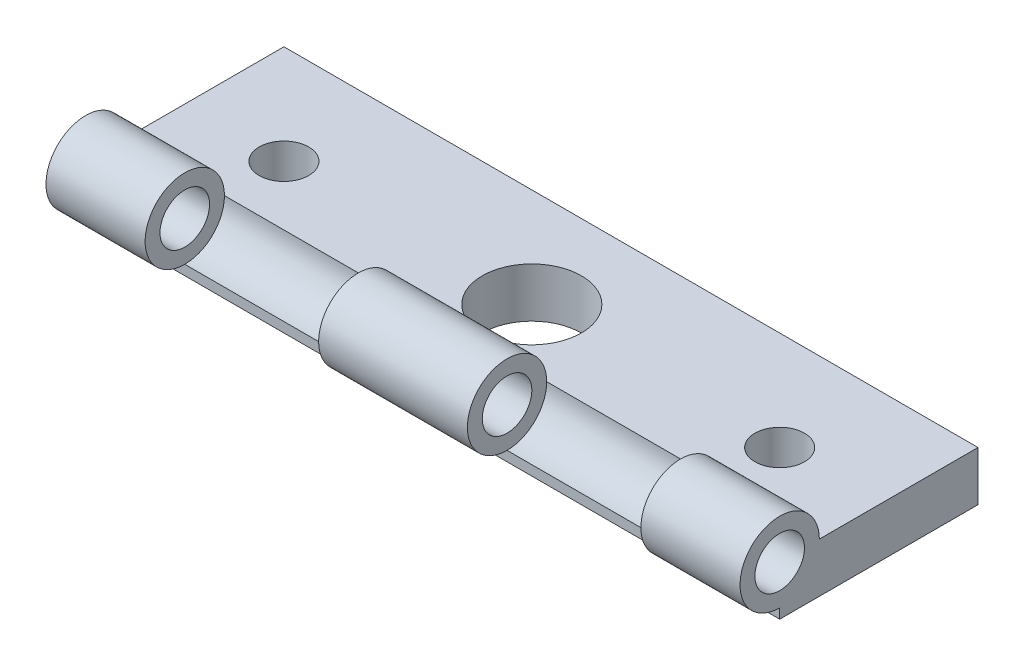
ISO-10303-21;
HEADER;
FILE_DESCRIPTION(('STEP AP214'),'2;1');
FILE_NAME('part.step','',(''),(''),'','','');
FILE_SCHEMA(('AUTOMOTIVE_DESIGN { 1 0 10303 214 1 1 1 1 }'));
ENDSEC;
DATA;
#1=APPLICATION_CONTEXT('core data for automotive mechanical design processes');
#2=APPLICATION_PROTOCOL_DEFINITION('international standard','automotive_design',2000,#1);
#3=PRODUCT_CONTEXT('',#1,'mechanical');
#4=PRODUCT('Part','Part','',(#3));
#5=PRODUCT_RELATED_PRODUCT_CATEGORY('part','',(#4));
#6=PRODUCT_DEFINITION_FORMATION('','',#4);
#7=PRODUCT_DEFINITION_CONTEXT('part definition',#1,'design');
#8=PRODUCT_DEFINITION('design','',#6,#7);
#9=PRODUCT_DEFINITION_SHAPE('','',#8);
#10=(LENGTH_UNIT() NAMED_UNIT(*) SI_UNIT(.MILLI.,.METRE.));
#11=(NAMED_UNIT(*) PLANE_ANGLE_UNIT() SI_UNIT($,.RADIAN.));
#12=(NAMED_UNIT(*) SI_UNIT($,.STERADIAN.) SOLID_ANGLE_UNIT());
#13=UNCERTAINTY_MEASURE_WITH_UNIT(LENGTH_MEASURE(1.E-05),#10,'distance_accuracy_value','');
#14=(GEOMETRIC_REPRESENTATION_CONTEXT(3) GLOBAL_UNCERTAINTY_ASSIGNED_CONTEXT((#13)) GLOBAL_UNIT_ASSIGNED_CONTEXT((#10,
#11,#12)) REPRESENTATION_CONTEXT('',''));
#15=CARTESIAN_POINT('',(0.,0.,0.));
#16=DIRECTION('',(0.,0.,1.));
#17=DIRECTION('',(1.,0.,0.));
#18=AXIS2_PLACEMENT_3D('',#15,#16,#17);
#19=CARTESIAN_POINT('',(44.45,6.35,0.));
#20=DIRECTION('',(-1.,0.,0.));
#21=DIRECTION('',(0.,0.,1.));
#22=AXIS2_PLACEMENT_3D('',#19,#20,#21);
#23=CYLINDRICAL_SURFACE('',#22,5.08);
#24=CARTESIAN_POINT('',(-9.525,6.35,0.));
#25=DIRECTION('',(1.,0.,0.));
#26=DIRECTION('',(0.,0.,-1.));
#27=AXIS2_PLACEMENT_3D('',#24,#25,#26);
#28=CIRCLE('',#27,5.08);
#29=CARTESIAN_POINT('',(-9.525,1.27,0.));
#30=VERTEX_POINT('',#29);
#31=CARTESIAN_POINT('',(-9.525,6.35,-5.08));
#32=VERTEX_POINT('',#31);
#33=EDGE_CURVE('E371',#30,#32,#28,.T.);
#34=ORIENTED_EDGE('',*,*,#33,.T.);
#35=DIRECTION('',(-1.,0.,0.));
#36=VECTOR('',#35,1.);
#37=CARTESIAN_POINT('',(44.45,6.35,-5.08));
#38=LINE('',#37,#36);
#39=CARTESIAN_POINT('',(-31.75,6.35,-5.08));
#40=VERTEX_POINT('',#39);
#41=EDGE_CURVE('E133',#40,#32,#38,.F.);
#42=ORIENTED_EDGE('',*,*,#41,.F.);
#43=CARTESIAN_POINT('',(-31.75,6.35,0.));
#44=DIRECTION('',(-1.,0.,0.));
#45=DIRECTION('',(0.,0.,1.));
#46=AXIS2_PLACEMENT_3D('',#43,#44,#45);
#47=CIRCLE('',#46,5.08);
#48=CARTESIAN_POINT('',(-31.75,1.27,0.));
#49=VERTEX_POINT('',#48);
#50=EDGE_CURVE('E134',#40,#49,#47,.T.);
#51=ORIENTED_EDGE('',*,*,#50,.T.);
#52=DIRECTION('',(-1.,0.,0.));
#53=VECTOR('',#52,1.);
#54=CARTESIAN_POINT('',(44.45,1.27,0.));
#55=LINE('',#54,#53);
#56=EDGE_CURVE('E48',#30,#49,#55,.T.);
#57=ORIENTED_EDGE('',*,*,#56,.F.);
#58=EDGE_LOOP('',(#34,#42,#51,#57));
#59=FACE_BOUND('',#58,.T.);
#60=ADVANCED_FACE('F39',(#59),#23,.F.);
#61=CARTESIAN_POINT('',(9.525,6.35,-5.08));
#62=VERTEX_POINT('',#61);
#63=CARTESIAN_POINT('',(31.75,6.35,-5.08));
#64=VERTEX_POINT('',#63);
#65=EDGE_CURVE('E128',#62,#64,#38,.F.);
#66=ORIENTED_EDGE('',*,*,#65,.F.);
#67=CARTESIAN_POINT('',(9.525,6.35,0.));
#68=DIRECTION('',(1.,0.,0.));
#69=DIRECTION('',(0.,0.,-1.));
#70=AXIS2_PLACEMENT_3D('',#67,#68,#69);
#71=CIRCLE('',#70,5.08);
#72=CARTESIAN_POINT('',(9.525,1.27,0.));
#73=VERTEX_POINT('',#72);
#74=EDGE_CURVE('E113',#73,#62,#71,.T.);
#75=ORIENTED_EDGE('',*,*,#74,.F.);
#76=CARTESIAN_POINT('',(31.75,1.27,0.));
#77=VERTEX_POINT('',#76);
#78=EDGE_CURVE('E47',#77,#73,#55,.T.);
#79=ORIENTED_EDGE('',*,*,#78,.F.);
#80=CARTESIAN_POINT('',(31.75,6.35,0.));
#81=DIRECTION('',(-1.,0.,0.));
#82=DIRECTION('',(0.,0.,1.));
#83=AXIS2_PLACEMENT_3D('',#80,#81,#82);
#84=CIRCLE('',#83,5.08);
#85=EDGE_CURVE('E63',#64,#77,#84,.T.);
#86=ORIENTED_EDGE('',*,*,#85,.F.);
#87=EDGE_LOOP('',(#66,#75,#79,#86));
#88=FACE_BOUND('',#87,.T.);
#89=ADVANCED_FACE('F129',(#88),#23,.F.);
#90=CARTESIAN_POINT('',(0.,6.35,0.));
#91=DIRECTION('',(0.,-1.,0.));
#92=DIRECTION('',(0.,0.,-1.));
#93=AXIS2_PLACEMENT_3D('',#90,#91,#92);
#94=PLANE('',#93);
#95=DIRECTION('',(0.,0.,1.));
#96=VECTOR('',#95,1.);
#97=CARTESIAN_POINT('',(-44.45,6.35,0.));
#98=LINE('',#97,#96);
#99=CARTESIAN_POINT('',(-44.45,6.35,-25.4));
#100=VERTEX_POINT('',#99);
#101=CARTESIAN_POINT('',(-44.45,6.35,-5.08));
#102=VERTEX_POINT('',#101);
#103=EDGE_CURVE('E192',#100,#102,#98,.T.);
#104=ORIENTED_EDGE('',*,*,#103,.T.);
#105=EDGE_CURVE('E136',#102,#40,#38,.F.);
#106=ORIENTED_EDGE('',*,*,#105,.T.);
#107=ORIENTED_EDGE('',*,*,#41,.T.);
#108=DIRECTION('',(-1.,0.,0.));
#109=VECTOR('',#108,1.);
#110=CARTESIAN_POINT('',(9.525,6.35,-5.08));
#111=LINE('',#110,#109);
#112=EDGE_CURVE('E125',#62,#32,#111,.T.);
#113=ORIENTED_EDGE('',*,*,#112,.F.);
#114=ORIENTED_EDGE('',*,*,#65,.T.);
#115=DIRECTION('',(1.,0.,0.));
#116=VECTOR('',#115,1.);
#117=CARTESIAN_POINT('',(31.75,6.35,-5.08));
#118=LINE('',#117,#116);
#119=CARTESIAN_POINT('',(44.45,6.35,-5.08));
#120=VERTEX_POINT('',#119);
#121=EDGE_CURVE('E152',#120,#64,#118,.F.);
#122=ORIENTED_EDGE('',*,*,#121,.F.);
#123=DIRECTION('',(0.,0.,-1.));
#124=VECTOR('',#123,1.);
#125=CARTESIAN_POINT('',(44.45,6.35,0.));
#126=LINE('',#125,#124);
#127=CARTESIAN_POINT('',(44.45,6.35,-25.4));
#128=VERTEX_POINT('',#127);
#129=EDGE_CURVE('E187',#120,#128,#126,.T.);
#130=ORIENTED_EDGE('',*,*,#129,.T.);
#131=DIRECTION('',(-1.,0.,0.));
#132=VECTOR('',#131,1.);
#133=CARTESIAN_POINT('',(-44.45,6.35,-25.4));
#134=LINE('',#133,#132);
#135=EDGE_CURVE('E189',#128,#100,#134,.T.);
#136=ORIENTED_EDGE('',*,*,#135,.T.);
#137=EDGE_LOOP('',(#104,#106,#107,#113,#114,#122,#130,#136));
#138=FACE_BOUND('',#137,.T.);
#139=CARTESIAN_POINT('',(-31.75,6.35,-12.7));
#140=DIRECTION('',(0.,1.,0.));
#141=DIRECTION('',(0.,0.,1.));
#142=AXIS2_PLACEMENT_3D('',#139,#140,#141);
#143=CIRCLE('',#142,3.175);
#144=CARTESIAN_POINT('',(-31.75,6.35,-9.52500000000001));
#145=VERTEX_POINT('',#144);
#146=EDGE_CURVE('E181',#145,#145,#143,.T.);
#147=ORIENTED_EDGE('',*,*,#146,.F.);
#148=EDGE_LOOP('',(#147));
#149=FACE_BOUND('',#148,.T.);
#150=CARTESIAN_POINT('',(0.,6.35,-12.7));
#151=DIRECTION('',(0.,1.,0.));
#152=DIRECTION('',(0.,0.,1.));
#153=AXIS2_PLACEMENT_3D('',#150,#151,#152);
#154=CIRCLE('',#153,6.35);
#155=CARTESIAN_POINT('',(0.,6.35,-6.35));
#156=VERTEX_POINT('',#155);
#157=EDGE_CURVE('E175',#156,#156,#154,.T.);
#158=ORIENTED_EDGE('',*,*,#157,.F.);
#159=EDGE_LOOP('',(#158));
#160=FACE_BOUND('',#159,.T.);
#161=CARTESIAN_POINT('',(31.75,6.35,-12.7));
#162=DIRECTION('',(0.,1.,0.));
#163=DIRECTION('',(0.,0.,1.));
#164=AXIS2_PLACEMENT_3D('',#161,#162,#163);
#165=CIRCLE('',#164,3.175);
#166=CARTESIAN_POINT('',(31.75,6.35,-9.52500000000001));
#167=VERTEX_POINT('',#166);
#168=EDGE_CURVE('E169',#167,#167,#165,.T.);
#169=ORIENTED_EDGE('',*,*,#168,.F.);
#170=EDGE_LOOP('',(#169));
#171=FACE_BOUND('',#170,.T.);
#172=ADVANCED_FACE('F138',(#138,#149,#160,#171),#94,.F.);
#173=CARTESIAN_POINT('',(0.,0.,0.));
#174=DIRECTION('',(0.,-1.,0.));
#175=DIRECTION('',(0.,0.,-1.));
#176=AXIS2_PLACEMENT_3D('',#173,#174,#175);
#177=PLANE('',#176);
#178=CARTESIAN_POINT('',(0.,0.,-12.7));
#179=DIRECTION('',(0.,1.,0.));
#180=DIRECTION('',(0.,0.,1.));
#181=AXIS2_PLACEMENT_3D('',#178,#179,#180);
#182=CIRCLE('',#181,6.35);
#183=CARTESIAN_POINT('',(0.,0.,-6.35));
#184=VERTEX_POINT('',#183);
#185=EDGE_CURVE('E172',#184,#184,#182,.T.);
#186=ORIENTED_EDGE('',*,*,#185,.T.);
#187=EDGE_LOOP('',(#186));
#188=FACE_BOUND('',#187,.T.);
#189=DIRECTION('',(0.,0.,-1.));
#190=VECTOR('',#189,1.);
#191=CARTESIAN_POINT('',(44.45,0.,0.));
#192=LINE('',#191,#190);
#193=CARTESIAN_POINT('',(44.45,0.,0.));
#194=VERTEX_POINT('',#193);
#195=CARTESIAN_POINT('',(44.45,0.,-25.4));
#196=VERTEX_POINT('',#195);
#197=EDGE_CURVE('E184',#194,#196,#192,.T.);
#198=ORIENTED_EDGE('',*,*,#197,.F.);
#199=DIRECTION('',(1.,0.,0.));
#200=VECTOR('',#199,1.);
#201=CARTESIAN_POINT('',(-44.45,0.,0.));
#202=LINE('',#201,#200);
#203=CARTESIAN_POINT('',(-44.45,0.,0.));
#204=VERTEX_POINT('',#203);
#205=EDGE_CURVE('E190',#204,#194,#202,.T.);
#206=ORIENTED_EDGE('',*,*,#205,.F.);
#207=DIRECTION('',(0.,0.,1.));
#208=VECTOR('',#207,1.);
#209=CARTESIAN_POINT('',(-44.45,0.,0.));
#210=LINE('',#209,#208);
#211=CARTESIAN_POINT('',(-44.45,0.,-25.4));
#212=VERTEX_POINT('',#211);
#213=EDGE_CURVE('E199',#212,#204,#210,.T.);
#214=ORIENTED_EDGE('',*,*,#213,.F.);
#215=DIRECTION('',(-1.,0.,0.));
#216=VECTOR('',#215,1.);
#217=CARTESIAN_POINT('',(-44.45,0.,-25.4));
#218=LINE('',#217,#216);
#219=EDGE_CURVE('E197',#196,#212,#218,.T.);
#220=ORIENTED_EDGE('',*,*,#219,.F.);
#221=EDGE_LOOP('',(#198,#206,#214,#220));
#222=FACE_BOUND('',#221,.T.);
#223=CARTESIAN_POINT('',(-31.75,0.,-12.7));
#224=DIRECTION('',(0.,1.,0.));
#225=DIRECTION('',(0.,0.,1.));
#226=AXIS2_PLACEMENT_3D('',#223,#224,#225);
#227=CIRCLE('',#226,3.175);
#228=CARTESIAN_POINT('',(-31.75,0.,-9.52500000000001));
#229=VERTEX_POINT('',#228);
#230=EDGE_CURVE('E178',#229,#229,#227,.T.);
#231=ORIENTED_EDGE('',*,*,#230,.T.);
#232=EDGE_LOOP('',(#231));
#233=FACE_BOUND('',#232,.T.);
#234=CARTESIAN_POINT('',(31.75,0.,-12.7));
#235=DIRECTION('',(0.,1.,0.));
#236=DIRECTION('',(0.,0.,1.));
#237=AXIS2_PLACEMENT_3D('',#234,#235,#236);
#238=CIRCLE('',#237,3.175);
#239=CARTESIAN_POINT('',(31.75,0.,-9.52500000000001));
#240=VERTEX_POINT('',#239);
#241=EDGE_CURVE('E168',#240,#240,#238,.T.);
#242=ORIENTED_EDGE('',*,*,#241,.T.);
#243=EDGE_LOOP('',(#242));
#244=FACE_BOUND('',#243,.T.);
#245=ADVANCED_FACE('F264',(#188,#222,#233,#244),#177,.T.);
#246=CARTESIAN_POINT('',(44.45,6.35,0.));
#247=DIRECTION('',(-1.,0.,0.));
#248=DIRECTION('',(0.,0.,1.));
#249=AXIS2_PLACEMENT_3D('',#246,#247,#248);
#250=PLANE('',#249);
#251=ORIENTED_EDGE('',*,*,#129,.F.);
#252=CARTESIAN_POINT('',(44.45,6.35,0.));
#253=DIRECTION('',(-1.,0.,0.));
#254=DIRECTION('',(0.,0.,1.));
#255=AXIS2_PLACEMENT_3D('',#252,#253,#254);
#256=CIRCLE('',#255,5.08);
#257=CARTESIAN_POINT('',(44.45,1.27,0.));
#258=VERTEX_POINT('',#257);
#259=EDGE_CURVE('E149',#258,#120,#256,.T.);
#260=ORIENTED_EDGE('',*,*,#259,.F.);
#261=DIRECTION('',(0.,-1.,0.));
#262=VECTOR('',#261,1.);
#263=CARTESIAN_POINT('',(44.45,6.35,0.));
#264=LINE('',#263,#262);
#265=EDGE_CURVE('E194',#258,#194,#264,.T.);
#266=ORIENTED_EDGE('',*,*,#265,.T.);
#267=ORIENTED_EDGE('',*,*,#197,.T.);
#268=DIRECTION('',(0.,-1.,0.));
#269=VECTOR('',#268,1.);
#270=CARTESIAN_POINT('',(44.45,6.35,-25.4));
#271=LINE('',#270,#269);
#272=EDGE_CURVE('E209',#128,#196,#271,.T.);
#273=ORIENTED_EDGE('',*,*,#272,.F.);
#274=EDGE_LOOP('',(#251,#260,#266,#267,#273));
#275=FACE_BOUND('',#274,.T.);
#276=CARTESIAN_POINT('',(44.45,6.35,0.));
#277=DIRECTION('',(-1.,0.,0.));
#278=DIRECTION('',(0.,0.,1.));
#279=AXIS2_PLACEMENT_3D('',#276,#277,#278);
#280=CIRCLE('',#279,3.175);
#281=CARTESIAN_POINT('',(44.45,6.35,3.175));
#282=VERTEX_POINT('',#281);
#283=EDGE_CURVE('E141',#282,#282,#280,.T.);
#284=ORIENTED_EDGE('',*,*,#283,.T.);
#285=EDGE_LOOP('',(#284));
#286=FACE_BOUND('',#285,.T.);
#287=ADVANCED_FACE('F41',(#275,#286),#250,.F.);
#288=CARTESIAN_POINT('',(-44.45,6.35,-25.4));
#289=DIRECTION('',(0.,0.,1.));
#290=DIRECTION('',(1.,0.,0.));
#291=AXIS2_PLACEMENT_3D('',#288,#289,#290);
#292=PLANE('',#291);
#293=ORIENTED_EDGE('',*,*,#219,.T.);
#294=DIRECTION('',(0.,-1.,0.));
#295=VECTOR('',#294,1.);
#296=CARTESIAN_POINT('',(-44.45,6.35,-25.4));
#297=LINE('',#296,#295);
#298=EDGE_CURVE('E207',#100,#212,#297,.T.);
#299=ORIENTED_EDGE('',*,*,#298,.F.);
#300=ORIENTED_EDGE('',*,*,#135,.F.);
#301=ORIENTED_EDGE('',*,*,#272,.T.);
#302=EDGE_LOOP('',(#293,#299,#300,#301));
#303=FACE_BOUND('',#302,.T.);
#304=ADVANCED_FACE('F272',(#303),#292,.F.);
#305=CARTESIAN_POINT('',(-44.45,6.35,0.));
#306=DIRECTION('',(1.,0.,0.));
#307=DIRECTION('',(0.,0.,-1.));
#308=AXIS2_PLACEMENT_3D('',#305,#306,#307);
#309=PLANE('',#308);
#310=DIRECTION('',(0.,-1.,0.));
#311=VECTOR('',#310,1.);
#312=CARTESIAN_POINT('',(-44.45,6.35,0.));
#313=LINE('',#312,#311);
#314=CARTESIAN_POINT('',(-44.45,1.27,0.));
#315=VERTEX_POINT('',#314);
#316=EDGE_CURVE('E205',#315,#204,#313,.T.);
#317=ORIENTED_EDGE('',*,*,#316,.F.);
#318=CARTESIAN_POINT('',(-44.45,6.35,0.));
#319=DIRECTION('',(-1.,0.,0.));
#320=DIRECTION('',(0.,0.,1.));
#321=AXIS2_PLACEMENT_3D('',#318,#319,#320);
#322=CIRCLE('',#321,5.08);
#323=EDGE_CURVE('E160',#315,#102,#322,.T.);
#324=ORIENTED_EDGE('',*,*,#323,.T.);
#325=ORIENTED_EDGE('',*,*,#103,.F.);
#326=ORIENTED_EDGE('',*,*,#298,.T.);
#327=ORIENTED_EDGE('',*,*,#213,.T.);
#328=EDGE_LOOP('',(#317,#324,#325,#326,#327));
#329=FACE_BOUND('',#328,.T.);
#330=CARTESIAN_POINT('',(-44.45,6.35,0.));
#331=DIRECTION('',(-1.,0.,0.));
#332=DIRECTION('',(0.,0.,1.));
#333=AXIS2_PLACEMENT_3D('',#330,#331,#332);
#334=CIRCLE('',#333,3.175);
#335=CARTESIAN_POINT('',(-44.45,6.35,3.175));
#336=VERTEX_POINT('',#335);
#337=EDGE_CURVE('E156',#336,#336,#334,.T.);
#338=ORIENTED_EDGE('',*,*,#337,.F.);
#339=EDGE_LOOP('',(#338));
#340=FACE_BOUND('',#339,.T.);
#341=ADVANCED_FACE('F270',(#329,#340),#309,.F.);
#342=CARTESIAN_POINT('',(-44.45,6.35,0.));
#343=DIRECTION('',(0.,0.,-1.));
#344=DIRECTION('',(-1.,0.,0.));
#345=AXIS2_PLACEMENT_3D('',#342,#343,#344);
#346=PLANE('',#345);
#347=ORIENTED_EDGE('',*,*,#265,.F.);
#348=EDGE_CURVE('E11',#258,#77,#55,.T.);
#349=ORIENTED_EDGE('',*,*,#348,.T.);
#350=ORIENTED_EDGE('',*,*,#78,.T.);
#351=EDGE_CURVE('E127',#73,#30,#55,.T.);
#352=ORIENTED_EDGE('',*,*,#351,.T.);
#353=ORIENTED_EDGE('',*,*,#56,.T.);
#354=EDGE_CURVE('E49',#49,#315,#55,.T.);
#355=ORIENTED_EDGE('',*,*,#354,.T.);
#356=ORIENTED_EDGE('',*,*,#316,.T.);
#357=ORIENTED_EDGE('',*,*,#205,.T.);
#358=EDGE_LOOP('',(#347,#349,#350,#352,#353,#355,#356,#357));
#359=FACE_BOUND('',#358,.T.);
#360=ADVANCED_FACE('F219',(#359),#346,.F.);
#361=CARTESIAN_POINT('',(-31.75,6.35,-12.7));
#362=DIRECTION('',(0.,-1.,0.));
#363=DIRECTION('',(0.,0.,-1.));
#364=AXIS2_PLACEMENT_3D('',#361,#362,#363);
#365=CYLINDRICAL_SURFACE('',#364,3.175);
#366=ORIENTED_EDGE('',*,*,#146,.T.);
#367=EDGE_LOOP('',(#366));
#368=FACE_BOUND('',#367,.T.);
#369=ORIENTED_EDGE('',*,*,#230,.F.);
#370=EDGE_LOOP('',(#369));
#371=FACE_BOUND('',#370,.T.);
#372=ADVANCED_FACE('F257',(#368,#371),#365,.F.);
#373=CARTESIAN_POINT('',(0.,6.35,-12.7));
#374=DIRECTION('',(0.,-1.,0.));
#375=DIRECTION('',(0.,0.,-1.));
#376=AXIS2_PLACEMENT_3D('',#373,#374,#375);
#377=CYLINDRICAL_SURFACE('',#376,6.35);
#378=ORIENTED_EDGE('',*,*,#157,.T.);
#379=EDGE_LOOP('',(#378));
#380=FACE_BOUND('',#379,.T.);
#381=ORIENTED_EDGE('',*,*,#185,.F.);
#382=EDGE_LOOP('',(#381));
#383=FACE_BOUND('',#382,.T.);
#384=ADVANCED_FACE('F253',(#380,#383),#377,.F.);
#385=CARTESIAN_POINT('',(31.75,6.35,-12.7));
#386=DIRECTION('',(0.,-1.,0.));
#387=DIRECTION('',(0.,0.,-1.));
#388=AXIS2_PLACEMENT_3D('',#385,#386,#387);
#389=CYLINDRICAL_SURFACE('',#388,3.175);
#390=ORIENTED_EDGE('',*,*,#168,.T.);
#391=EDGE_LOOP('',(#390));
#392=FACE_BOUND('',#391,.T.);
#393=ORIENTED_EDGE('',*,*,#241,.F.);
#394=EDGE_LOOP('',(#393));
#395=FACE_BOUND('',#394,.T.);
#396=ADVANCED_FACE('F242',(#392,#395),#389,.F.);
#397=CARTESIAN_POINT('',(-31.75,6.35,0.));
#398=DIRECTION('',(-1.,0.,0.));
#399=DIRECTION('',(0.,0.,1.));
#400=AXIS2_PLACEMENT_3D('',#397,#398,#399);
#401=CYLINDRICAL_SURFACE('',#400,5.08);
#402=ORIENTED_EDGE('',*,*,#105,.F.);
#403=ORIENTED_EDGE('',*,*,#323,.F.);
#404=ORIENTED_EDGE('',*,*,#354,.F.);
#405=EDGE_CURVE('E165',#49,#40,#47,.T.);
#406=ORIENTED_EDGE('',*,*,#405,.T.);
#407=EDGE_LOOP('',(#402,#403,#404,#406));
#408=FACE_BOUND('',#407,.T.);
#409=ADVANCED_FACE('F229',(#408),#401,.T.);
#410=CARTESIAN_POINT('',(-31.75,6.35,0.));
#411=DIRECTION('',(-1.,0.,0.));
#412=DIRECTION('',(0.,0.,1.));
#413=AXIS2_PLACEMENT_3D('',#410,#411,#412);
#414=PLANE('',#413);
#415=CARTESIAN_POINT('',(-31.75,6.35,0.));
#416=DIRECTION('',(-1.,0.,0.));
#417=DIRECTION('',(0.,0.,1.));
#418=AXIS2_PLACEMENT_3D('',#415,#416,#417);
#419=CIRCLE('',#418,3.175);
#420=CARTESIAN_POINT('',(-31.75,6.35,3.175));
#421=VERTEX_POINT('',#420);
#422=EDGE_CURVE('E157',#421,#421,#419,.T.);
#423=ORIENTED_EDGE('',*,*,#422,.T.);
#424=EDGE_LOOP('',(#423));
#425=FACE_BOUND('',#424,.T.);
#426=ORIENTED_EDGE('',*,*,#50,.F.);
#427=ORIENTED_EDGE('',*,*,#405,.F.);
#428=EDGE_LOOP('',(#426,#427));
#429=FACE_BOUND('',#428,.T.);
#430=ADVANCED_FACE('F230',(#425,#429),#414,.F.);
#431=CARTESIAN_POINT('',(-31.75,6.35,0.));
#432=DIRECTION('',(-1.,0.,0.));
#433=DIRECTION('',(0.,0.,1.));
#434=AXIS2_PLACEMENT_3D('',#431,#432,#433);
#435=CYLINDRICAL_SURFACE('',#434,3.175);
#436=ORIENTED_EDGE('',*,*,#422,.F.);
#437=EDGE_LOOP('',(#436));
#438=FACE_BOUND('',#437,.T.);
#439=ORIENTED_EDGE('',*,*,#337,.T.);
#440=EDGE_LOOP('',(#439));
#441=FACE_BOUND('',#440,.T.);
#442=ADVANCED_FACE('F232',(#438,#441),#435,.F.);
#443=CARTESIAN_POINT('',(31.75,6.35,0.));
#444=DIRECTION('',(1.,0.,0.));
#445=DIRECTION('',(0.,0.,-1.));
#446=AXIS2_PLACEMENT_3D('',#443,#444,#445);
#447=CYLINDRICAL_SURFACE('',#446,5.08);
#448=ORIENTED_EDGE('',*,*,#259,.T.);
#449=ORIENTED_EDGE('',*,*,#121,.T.);
#450=EDGE_CURVE('E153',#77,#64,#84,.T.);
#451=ORIENTED_EDGE('',*,*,#450,.F.);
#452=ORIENTED_EDGE('',*,*,#348,.F.);
#453=EDGE_LOOP('',(#448,#449,#451,#452));
#454=FACE_BOUND('',#453,.T.);
#455=ADVANCED_FACE('F239',(#454),#447,.T.);
#456=CARTESIAN_POINT('',(31.75,6.35,0.));
#457=DIRECTION('',(1.,0.,0.));
#458=DIRECTION('',(0.,0.,1.));
#459=AXIS2_PLACEMENT_3D('',#456,#457,#458);
#460=PLANE('',#459);
#461=ORIENTED_EDGE('',*,*,#85,.T.);
#462=ORIENTED_EDGE('',*,*,#450,.T.);
#463=EDGE_LOOP('',(#461,#462));
#464=FACE_BOUND('',#463,.T.);
#465=CARTESIAN_POINT('',(31.75,6.35,0.));
#466=DIRECTION('',(-1.,0.,0.));
#467=DIRECTION('',(0.,0.,1.));
#468=AXIS2_PLACEMENT_3D('',#465,#466,#467);
#469=CIRCLE('',#468,3.175);
#470=CARTESIAN_POINT('',(31.75,6.35,3.175));
#471=VERTEX_POINT('',#470);
#472=EDGE_CURVE('E144',#471,#471,#469,.T.);
#473=ORIENTED_EDGE('',*,*,#472,.F.);
#474=EDGE_LOOP('',(#473));
#475=FACE_BOUND('',#474,.T.);
#476=ADVANCED_FACE('F291',(#464,#475),#460,.F.);
#477=CARTESIAN_POINT('',(31.75,6.35,0.));
#478=DIRECTION('',(1.,0.,0.));
#479=DIRECTION('',(0.,0.,-1.));
#480=AXIS2_PLACEMENT_3D('',#477,#478,#479);
#481=CYLINDRICAL_SURFACE('',#480,3.175);
#482=ORIENTED_EDGE('',*,*,#472,.T.);
#483=EDGE_LOOP('',(#482));
#484=FACE_BOUND('',#483,.T.);
#485=ORIENTED_EDGE('',*,*,#283,.F.);
#486=EDGE_LOOP('',(#485));
#487=FACE_BOUND('',#486,.T.);
#488=ADVANCED_FACE('F294',(#484,#487),#481,.F.);
#489=CARTESIAN_POINT('',(9.525,6.35,0.));
#490=DIRECTION('',(-1.,0.,0.));
#491=DIRECTION('',(0.,0.,1.));
#492=AXIS2_PLACEMENT_3D('',#489,#490,#491);
#493=CYLINDRICAL_SURFACE('',#492,5.08);
#494=EDGE_CURVE('E117',#62,#73,#71,.T.);
#495=ORIENTED_EDGE('',*,*,#494,.F.);
#496=ORIENTED_EDGE('',*,*,#112,.T.);
#497=EDGE_CURVE('E56',#32,#30,#28,.T.);
#498=ORIENTED_EDGE('',*,*,#497,.T.);
#499=ORIENTED_EDGE('',*,*,#351,.F.);
#500=EDGE_LOOP('',(#495,#496,#498,#499));
#501=FACE_BOUND('',#500,.T.);
#502=ADVANCED_FACE('F123',(#501),#493,.T.);
#503=CARTESIAN_POINT('',(9.525,6.35,0.));
#504=DIRECTION('',(1.,0.,0.));
#505=DIRECTION('',(0.,0.,-1.));
#506=AXIS2_PLACEMENT_3D('',#503,#504,#505);
#507=PLANE('',#506);
#508=ORIENTED_EDGE('',*,*,#494,.T.);
#509=ORIENTED_EDGE('',*,*,#74,.T.);
#510=EDGE_LOOP('',(#508,#509));
#511=FACE_BOUND('',#510,.T.);
#512=CARTESIAN_POINT('',(9.525,6.35,0.));
#513=DIRECTION('',(1.,0.,0.));
#514=DIRECTION('',(0.,0.,-1.));
#515=AXIS2_PLACEMENT_3D('',#512,#513,#514);
#516=CIRCLE('',#515,3.175);
#517=CARTESIAN_POINT('',(9.525,6.35,3.175));
#518=VERTEX_POINT('',#517);
#519=EDGE_CURVE('E365',#518,#518,#516,.T.);
#520=ORIENTED_EDGE('',*,*,#519,.F.);
#521=EDGE_LOOP('',(#520));
#522=FACE_BOUND('',#521,.T.);
#523=ADVANCED_FACE('F115',(#511,#522),#507,.T.);
#524=CARTESIAN_POINT('',(-9.525,6.35,0.));
#525=DIRECTION('',(1.,0.,0.));
#526=DIRECTION('',(0.,0.,-1.));
#527=AXIS2_PLACEMENT_3D('',#524,#525,#526);
#528=PLANE('',#527);
#529=ORIENTED_EDGE('',*,*,#497,.F.);
#530=ORIENTED_EDGE('',*,*,#33,.F.);
#531=EDGE_LOOP('',(#529,#530));
#532=FACE_BOUND('',#531,.T.);
#533=CARTESIAN_POINT('',(-9.525,6.35,0.));
#534=DIRECTION('',(1.,0.,0.));
#535=DIRECTION('',(0.,0.,-1.));
#536=AXIS2_PLACEMENT_3D('',#533,#534,#535);
#537=CIRCLE('',#536,3.175);
#538=CARTESIAN_POINT('',(-9.525,6.35,3.175));
#539=VERTEX_POINT('',#538);
#540=EDGE_CURVE('E368',#539,#539,#537,.T.);
#541=ORIENTED_EDGE('',*,*,#540,.T.);
#542=EDGE_LOOP('',(#541));
#543=FACE_BOUND('',#542,.T.);
#544=ADVANCED_FACE('F341',(#532,#543),#528,.F.);
#545=CARTESIAN_POINT('',(9.525,6.35,0.));
#546=DIRECTION('',(-1.,0.,0.));
#547=DIRECTION('',(0.,0.,1.));
#548=AXIS2_PLACEMENT_3D('',#545,#546,#547);
#549=CYLINDRICAL_SURFACE('',#548,3.175);
#550=CARTESIAN_POINT('',(9.525,6.35,3.175));
#551=CARTESIAN_POINT('',(9.3265625,6.35,3.175));
#552=CARTESIAN_POINT('',(9.128125,6.35,3.175));
#553=CARTESIAN_POINT('',(8.73125,6.35,3.175));
#554=CARTESIAN_POINT('',(8.5328125,6.35,3.175));
#555=CARTESIAN_POINT('',(8.1359375,6.35,3.175));
#556=CARTESIAN_POINT('',(7.9375,6.35,3.175));
#557=CARTESIAN_POINT('',(7.540625,6.35,3.175));
#558=CARTESIAN_POINT('',(7.3421875,6.35,3.175));
#559=CARTESIAN_POINT('',(6.9453125,6.35,3.175));
#560=CARTESIAN_POINT('',(6.746875,6.35,3.175));
#561=CARTESIAN_POINT('',(6.35,6.35,3.175));
#562=CARTESIAN_POINT('',(6.1515625,6.35,3.175));
#563=CARTESIAN_POINT('',(5.7546875,6.35,3.175));
#564=CARTESIAN_POINT('',(5.55625,6.35,3.175));
#565=CARTESIAN_POINT('',(5.159375,6.35,3.175));
#566=CARTESIAN_POINT('',(4.9609375,6.35,3.175));
#567=CARTESIAN_POINT('',(4.5640625,6.35,3.175));
#568=CARTESIAN_POINT('',(4.365625,6.35,3.175));
#569=CARTESIAN_POINT('',(3.96875,6.35,3.175));
#570=CARTESIAN_POINT('',(3.7703125,6.35,3.175));
#571=CARTESIAN_POINT('',(3.3734375,6.35,3.175));
#572=CARTESIAN_POINT('',(3.175,6.35,3.175));
#573=CARTESIAN_POINT('',(2.778125,6.35,3.175));
#574=CARTESIAN_POINT('',(2.5796875,6.35,3.175));
#575=CARTESIAN_POINT('',(2.1828125,6.35,3.175));
#576=CARTESIAN_POINT('',(1.984375,6.35,3.175));
#577=CARTESIAN_POINT('',(1.5875,6.35,3.175));
#578=CARTESIAN_POINT('',(1.3890625,6.35,3.175));
#579=CARTESIAN_POINT('',(0.992187499999999,6.35,3.175));
#580=CARTESIAN_POINT('',(0.793749999999999,6.35,3.175));
#581=CARTESIAN_POINT('',(0.396874999999998,6.35,3.175));
#582=CARTESIAN_POINT('',(0.198437499999998,6.35,3.175));
#583=CARTESIAN_POINT('',(-0.198437500000002,6.35,3.175));
#584=CARTESIAN_POINT('',(-0.396875000000002,6.35,3.175));
#585=CARTESIAN_POINT('',(-0.793750000000002,6.35,3.175));
#586=CARTESIAN_POINT('',(-0.992187500000002,6.35,3.175));
#587=CARTESIAN_POINT('',(-1.3890625,6.35,3.175));
#588=CARTESIAN_POINT('',(-1.5875,6.35,3.175));
#589=CARTESIAN_POINT('',(-1.984375,6.35,3.175));
#590=CARTESIAN_POINT('',(-2.1828125,6.35,3.175));
#591=CARTESIAN_POINT('',(-2.5796875,6.35,3.175));
#592=CARTESIAN_POINT('',(-2.778125,6.35,3.175));
#593=CARTESIAN_POINT('',(-3.175,6.35,3.175));
#594=CARTESIAN_POINT('',(-3.3734375,6.35,3.175));
#595=CARTESIAN_POINT('',(-3.7703125,6.35,3.175));
#596=CARTESIAN_POINT('',(-3.96875,6.35,3.175));
#597=CARTESIAN_POINT('',(-4.365625,6.35,3.175));
#598=CARTESIAN_POINT('',(-4.5640625,6.35,3.175));
#599=CARTESIAN_POINT('',(-4.9609375,6.35,3.175));
#600=CARTESIAN_POINT('',(-5.159375,6.35,3.175));
#601=CARTESIAN_POINT('',(-5.55625,6.35,3.175));
#602=CARTESIAN_POINT('',(-5.7546875,6.35,3.175));
#603=CARTESIAN_POINT('',(-6.1515625,6.35,3.175));
#604=CARTESIAN_POINT('',(-6.35,6.35,3.175));
#605=CARTESIAN_POINT('',(-6.746875,6.35,3.175));
#606=CARTESIAN_POINT('',(-6.9453125,6.35,3.175));
#607=CARTESIAN_POINT('',(-7.3421875,6.35,3.175));
#608=CARTESIAN_POINT('',(-7.540625,6.35,3.175));
#609=CARTESIAN_POINT('',(-7.9375,6.35,3.175));
#610=CARTESIAN_POINT('',(-8.1359375,6.35,3.175));
#611=CARTESIAN_POINT('',(-8.5328125,6.35,3.175));
#612=CARTESIAN_POINT('',(-8.73125,6.35,3.175));
#613=CARTESIAN_POINT('',(-9.128125,6.35,3.175));
#614=CARTESIAN_POINT('',(-9.3265625,6.35,3.175));
#615=CARTESIAN_POINT('',(-9.525,6.35,3.175));
#616=B_SPLINE_CURVE_WITH_KNOTS('',3,(#550,#551,#552,#553,#554,#555,#556,#557,#558,#559,#560,
#561,#562,#563,#564,#565,#566,#567,#568,#569,#570,#571,#572,#573,#574,#575,#576,#577,#578,#579,
#580,#581,#582,#583,#584,#585,#586,#587,#588,#589,#590,#591,#592,#593,#594,#595,#596,#597,#598,
#599,#600,#601,#602,#603,#604,#605,#606,#607,#608,#609,#610,#611,#612,#613,#614,#615),
.UNSPECIFIED.,.F.,.F.,(4,2,2,2,2,2,2,2,2,2,2,2,2,2,2,2,2,2,2,2,2,2,2,2,2,2,2,2,2,2,2,2,4),(0.,
0.595312499999999,1.190625,1.7859375,2.38125,2.9765625,3.571875,4.1671875,4.7625,5.3578125,
5.953125,6.5484375,7.14375,7.7390625,8.334375,8.9296875,9.525,10.1203125,10.715625,11.3109375,
11.90625,12.5015625,13.096875,13.6921875,14.2875,14.8828125,15.478125,16.0734375,16.66875,
17.2640625,17.859375,18.4546875,19.05),.UNSPECIFIED.);
#617=EDGE_CURVE('BSEAM350',#518,#539,#616,.T.);
#618=ORIENTED_EDGE('',*,*,#519,.T.);
#619=ORIENTED_EDGE('',*,*,#540,.F.);
#620=ORIENTED_EDGE('',*,*,#617,.T.);
#621=ORIENTED_EDGE('',*,*,#617,.F.);
#622=EDGE_LOOP('',(#618,#620,#619,#621));
#623=FACE_BOUND('',#622,.T.);
#624=ADVANCED_FACE('F350',(#623),#549,.F.);
#625=CLOSED_SHELL('',(#60,#89,#172,#245,#287,#304,#341,#360,#372,#384,#396,#409,#430,#442,#455,
#476,#488,#502,#523,#544,#624));
#626=MANIFOLD_SOLID_BREP('B2',#625);
#627=ADVANCED_BREP_SHAPE_REPRESENTATION('',(#18,#626),#14);
#628=SHAPE_DEFINITION_REPRESENTATION(#9,#627);
ENDSEC;
END-ISO-10303-21;
